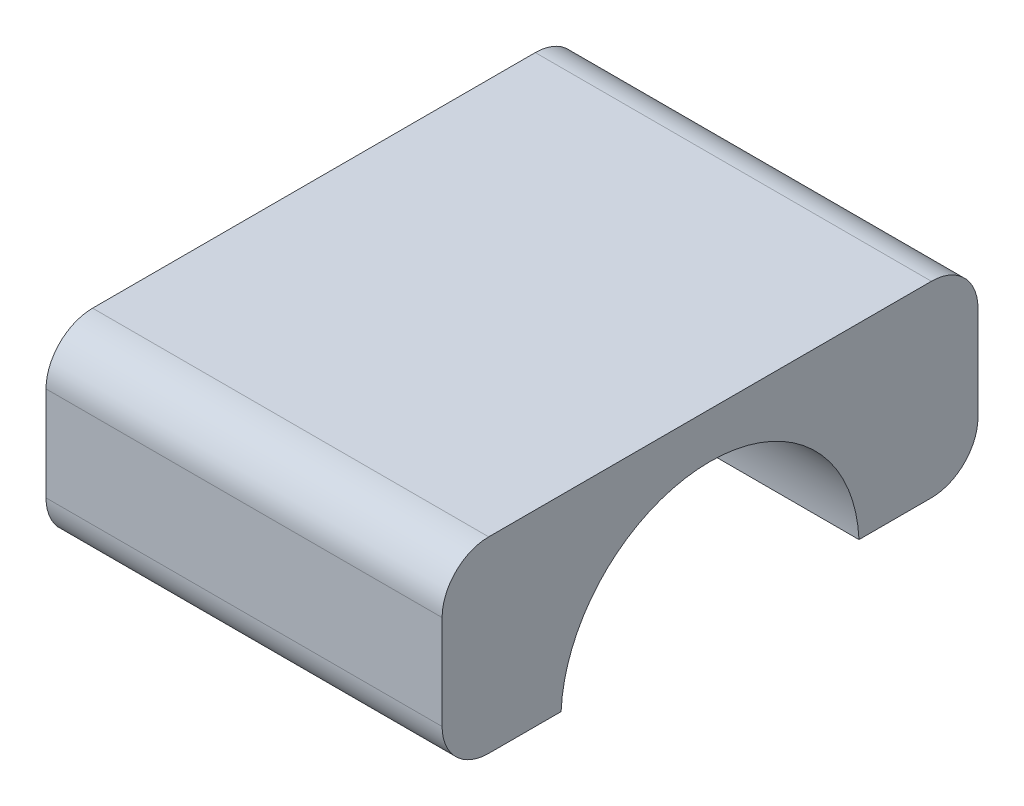
ISO-10303-21;
HEADER;
FILE_DESCRIPTION(('STEP AP214'),'2;1');
FILE_NAME('part.step','',(''),(''),'','','');
FILE_SCHEMA(('AUTOMOTIVE_DESIGN { 1 0 10303 214 1 1 1 1 }'));
ENDSEC;
DATA;
#1=APPLICATION_CONTEXT('core data for automotive mechanical design processes');
#2=APPLICATION_PROTOCOL_DEFINITION('international standard','automotive_design',2000,#1);
#3=PRODUCT_CONTEXT('',#1,'mechanical');
#4=PRODUCT('Part','Part','',(#3));
#5=PRODUCT_RELATED_PRODUCT_CATEGORY('part','',(#4));
#6=PRODUCT_DEFINITION_FORMATION('','',#4);
#7=PRODUCT_DEFINITION_CONTEXT('part definition',#1,'design');
#8=PRODUCT_DEFINITION('design','',#6,#7);
#9=PRODUCT_DEFINITION_SHAPE('','',#8);
#10=(LENGTH_UNIT() NAMED_UNIT(*) SI_UNIT(.MILLI.,.METRE.));
#11=(NAMED_UNIT(*) PLANE_ANGLE_UNIT() SI_UNIT($,.RADIAN.));
#12=(NAMED_UNIT(*) SI_UNIT($,.STERADIAN.) SOLID_ANGLE_UNIT());
#13=UNCERTAINTY_MEASURE_WITH_UNIT(LENGTH_MEASURE(1.E-05),#10,'distance_accuracy_value','');
#14=(GEOMETRIC_REPRESENTATION_CONTEXT(3) GLOBAL_UNCERTAINTY_ASSIGNED_CONTEXT((#13)) GLOBAL_UNIT_ASSIGNED_CONTEXT((#10,
#11,#12)) REPRESENTATION_CONTEXT('',''));
#15=CARTESIAN_POINT('',(0.,0.,0.));
#16=DIRECTION('',(0.,0.,1.));
#17=DIRECTION('',(1.,0.,0.));
#18=AXIS2_PLACEMENT_3D('',#15,#16,#17);
#19=CARTESIAN_POINT('',(17.,4.6,19.));
#20=DIRECTION('',(-1.,0.,0.));
#21=DIRECTION('',(0.,0.,1.));
#22=AXIS2_PLACEMENT_3D('',#19,#20,#21);
#23=CYLINDRICAL_SURFACE('',#22,4.);
#24=CARTESIAN_POINT('',(-10.6771243444677,0.6,19.));
#25=CARTESIAN_POINT('',(-10.7192506551599,0.600001174078135,19.0371518846942));
#26=CARTESIAN_POINT('',(-10.762919419632,0.600517310211942,19.0725074408913));
#27=CARTESIAN_POINT('',(-10.8530570336111,0.602290069309495,19.1394128146137));
#28=CARTESIAN_POINT('',(-10.8995254438069,0.603546576366918,19.1709632269095));
#29=CARTESIAN_POINT('',(-11.0425949485409,0.607988949122822,19.2595242307361));
#30=CARTESIAN_POINT('',(-11.1429753550835,0.611849230477293,19.3105458176302));
#31=CARTESIAN_POINT('',(-11.3508425605567,0.619327815303025,19.3950466501506));
#32=CARTESIAN_POINT('',(-11.4583309959682,0.622946062662407,19.4285218401249));
#33=CARTESIAN_POINT('',(-11.6774117692618,0.628466654639228,19.476994699731));
#34=CARTESIAN_POINT('',(-11.7890022984932,0.630369746260196,19.4920004144345));
#35=CARTESIAN_POINT('',(-12.0130484507786,0.631760391016297,19.5030985950613));
#36=CARTESIAN_POINT('',(-12.1255033675481,0.631249742329856,19.4992051403526));
#37=CARTESIAN_POINT('',(-12.3482139907828,0.628000437430484,19.4726447894183));
#38=CARTESIAN_POINT('',(-12.4584682827526,0.62526039266211,19.4499661929096));
#39=CARTESIAN_POINT('',(-12.673302325334,0.618598040792685,19.386581122766));
#40=CARTESIAN_POINT('',(-12.7778954111779,0.614678668676915,19.3459192872305));
#41=CARTESIAN_POINT('',(-12.9787287494616,0.607377499454782,19.2477239447546));
#42=CARTESIAN_POINT('',(-13.0749834093817,0.603994766357509,19.190220322867));
#43=CARTESIAN_POINT('',(-13.1929282707095,0.601347443085335,19.1056317655857));
#44=CARTESIAN_POINT('',(-13.2196776259688,0.60085739692341,19.0854065409097));
#45=CARTESIAN_POINT('',(-13.2720902769434,0.600183897303602,19.0436656427182));
#46=CARTESIAN_POINT('',(-13.2977550931037,0.599999999741905,19.0221518854178));
#47=CARTESIAN_POINT('',(-13.3228756555323,0.6,19.));
#48=B_SPLINE_CURVE_WITH_KNOTS('',3,(#24,#25,#26,#27,#28,#29,#30,#31,#32,#33,#34,#35,#36,#37,#38,
#39,#40,#41,#42,#43,#44,#45,#46,#47),.UNSPECIFIED.,.F.,.F.,(4,2,2,2,2,2,2,2,2,2,2,4),(0.,
0.16839344658215,0.336760537886406,0.673040899125638,1.0093989535434,1.34561044270103,
1.68157150188485,2.01774197113865,2.35308263893527,2.68783182694749,2.78841696352058,
2.88885606221805),.UNSPECIFIED.);
#49=CARTESIAN_POINT('',(-10.6771243444677,0.6,19.));
#50=VERTEX_POINT('',#49);
#51=CARTESIAN_POINT('',(-13.3228756555323,0.6,19.));
#52=VERTEX_POINT('',#51);
#53=EDGE_CURVE('E11',#50,#52,#48,.T.);
#54=ORIENTED_EDGE('',*,*,#53,.F.);
#55=DIRECTION('',(-1.,0.,0.));
#56=VECTOR('',#55,1.);
#57=CARTESIAN_POINT('',(17.,0.6,19.));
#58=LINE('',#57,#56);
#59=CARTESIAN_POINT('',(10.6771243444677,0.6,19.));
#60=VERTEX_POINT('',#59);
#61=EDGE_CURVE('E174',#60,#50,#58,.T.);
#62=ORIENTED_EDGE('',*,*,#61,.F.);
#63=CARTESIAN_POINT('',(13.3228756555323,0.6,19.));
#64=CARTESIAN_POINT('',(13.2807493448401,0.600001174078135,19.0371518846942));
#65=CARTESIAN_POINT('',(13.237080580368,0.600517310211942,19.0725074408913));
#66=CARTESIAN_POINT('',(13.1469429663889,0.602290069309495,19.1394128146137));
#67=CARTESIAN_POINT('',(13.1004745561931,0.603546576366918,19.1709632269095));
#68=CARTESIAN_POINT('',(12.9574050514591,0.607988949122822,19.2595242307361));
#69=CARTESIAN_POINT('',(12.8570246449165,0.611849230477293,19.3105458176302));
#70=CARTESIAN_POINT('',(12.6491574394433,0.619327815303025,19.3950466501506));
#71=CARTESIAN_POINT('',(12.5416690040318,0.622946062662407,19.4285218401249));
#72=CARTESIAN_POINT('',(12.3225882307382,0.628466654639228,19.476994699731));
#73=CARTESIAN_POINT('',(12.2109977015068,0.630369746260196,19.4920004144345));
#74=CARTESIAN_POINT('',(11.9869515492214,0.631760391016297,19.5030985950613));
#75=CARTESIAN_POINT('',(11.8744966324519,0.631249742329856,19.4992051403526));
#76=CARTESIAN_POINT('',(11.6517860092172,0.628000437430484,19.4726447894183));
#77=CARTESIAN_POINT('',(11.5415317172474,0.62526039266211,19.4499661929096));
#78=CARTESIAN_POINT('',(11.326697674666,0.618598040792685,19.386581122766));
#79=CARTESIAN_POINT('',(11.2221045888221,0.614678668676915,19.3459192872305));
#80=CARTESIAN_POINT('',(11.0212712505384,0.607377499454782,19.2477239447546));
#81=CARTESIAN_POINT('',(10.9250165906183,0.603994766357509,19.190220322867));
#82=CARTESIAN_POINT('',(10.8070717292905,0.601347443085335,19.1056317655857));
#83=CARTESIAN_POINT('',(10.7803223740312,0.60085739692341,19.0854065409097));
#84=CARTESIAN_POINT('',(10.7279097230566,0.600183897303602,19.0436656427182));
#85=CARTESIAN_POINT('',(10.7022449068963,0.599999999741905,19.0221518854178));
#86=CARTESIAN_POINT('',(10.6771243444677,0.6,19.));
#87=B_SPLINE_CURVE_WITH_KNOTS('',3,(#63,#64,#65,#66,#67,#68,#69,#70,#71,#72,#73,#74,#75,#76,#77,
#78,#79,#80,#81,#82,#83,#84,#85,#86),.UNSPECIFIED.,.F.,.F.,(4,2,2,2,2,2,2,2,2,2,2,4),(0.,
0.16839344658215,0.336760537886406,0.673040899125638,1.0093989535434,1.34561044270103,
1.68157150188485,2.01774197113865,2.35308263893527,2.68783182694749,2.78841696352057,
2.88885606221805),.UNSPECIFIED.);
#88=CARTESIAN_POINT('',(13.3228756555323,0.6,19.));
#89=VERTEX_POINT('',#88);
#90=EDGE_CURVE('E52',#89,#60,#87,.T.);
#91=ORIENTED_EDGE('',*,*,#90,.F.);
#92=CARTESIAN_POINT('',(17.,0.6,19.));
#93=VERTEX_POINT('',#92);
#94=EDGE_CURVE('E151',#93,#89,#58,.T.);
#95=ORIENTED_EDGE('',*,*,#94,.F.);
#96=CARTESIAN_POINT('',(17.,4.6,19.));
#97=DIRECTION('',(1.,0.,0.));
#98=DIRECTION('',(0.,0.,-1.));
#99=AXIS2_PLACEMENT_3D('',#96,#97,#98);
#100=CIRCLE('',#99,4.);
#101=CARTESIAN_POINT('',(17.,4.6,23.));
#102=VERTEX_POINT('',#101);
#103=EDGE_CURVE('E278',#102,#93,#100,.T.);
#104=ORIENTED_EDGE('',*,*,#103,.F.);
#105=DIRECTION('',(-1.,0.,0.));
#106=VECTOR('',#105,1.);
#107=CARTESIAN_POINT('',(17.,4.6,23.));
#108=LINE('',#107,#106);
#109=CARTESIAN_POINT('',(-17.,4.6,23.));
#110=VERTEX_POINT('',#109);
#111=EDGE_CURVE('E257',#102,#110,#108,.T.);
#112=ORIENTED_EDGE('',*,*,#111,.T.);
#113=CARTESIAN_POINT('',(-17.,4.6,19.));
#114=DIRECTION('',(1.,0.,0.));
#115=DIRECTION('',(0.,0.,-1.));
#116=AXIS2_PLACEMENT_3D('',#113,#114,#115);
#117=CIRCLE('',#116,4.);
#118=CARTESIAN_POINT('',(-17.,0.6,19.));
#119=VERTEX_POINT('',#118);
#120=EDGE_CURVE('E258',#110,#119,#117,.T.);
#121=ORIENTED_EDGE('',*,*,#120,.T.);
#122=EDGE_CURVE('E168',#52,#119,#58,.T.);
#123=ORIENTED_EDGE('',*,*,#122,.F.);
#124=EDGE_LOOP('',(#54,#62,#91,#95,#104,#112,#121,#123));
#125=FACE_BOUND('',#124,.T.);
#126=ADVANCED_FACE('F39',(#125),#23,.T.);
#127=CARTESIAN_POINT('',(17.,4.6,-19.));
#128=DIRECTION('',(-1.,0.,0.));
#129=DIRECTION('',(0.,0.,1.));
#130=AXIS2_PLACEMENT_3D('',#127,#128,#129);
#131=CYLINDRICAL_SURFACE('',#130,4.);
#132=CARTESIAN_POINT('',(10.6771243444677,0.6,-19.));
#133=CARTESIAN_POINT('',(10.7192506551599,0.600001174078135,-19.0371518846942));
#134=CARTESIAN_POINT('',(10.762919419632,0.600517310211942,-19.0725074408913));
#135=CARTESIAN_POINT('',(10.8530570336111,0.602290069309495,-19.1394128146137));
#136=CARTESIAN_POINT('',(10.8995254438069,0.603546576366918,-19.1709632269095));
#137=CARTESIAN_POINT('',(11.0425949485409,0.607988949122822,-19.2595242307361));
#138=CARTESIAN_POINT('',(11.1429753550835,0.611849230477293,-19.3105458176302));
#139=CARTESIAN_POINT('',(11.3508425605567,0.619327815303025,-19.3950466501506));
#140=CARTESIAN_POINT('',(11.4583309959682,0.622946062662407,-19.4285218401249));
#141=CARTESIAN_POINT('',(11.6774117692618,0.628466654639228,-19.476994699731));
#142=CARTESIAN_POINT('',(11.7890022984932,0.630369746260196,-19.4920004144345));
#143=CARTESIAN_POINT('',(12.0130484507786,0.631760391016297,-19.5030985950613));
#144=CARTESIAN_POINT('',(12.1255033675481,0.631249742329856,-19.4992051403526));
#145=CARTESIAN_POINT('',(12.3482139907828,0.628000437430484,-19.4726447894183));
#146=CARTESIAN_POINT('',(12.4584682827526,0.62526039266211,-19.4499661929096));
#147=CARTESIAN_POINT('',(12.673302325334,0.618598040792685,-19.386581122766));
#148=CARTESIAN_POINT('',(12.7778954111779,0.614678668676915,-19.3459192872305));
#149=CARTESIAN_POINT('',(12.9787287494616,0.607377499454782,-19.2477239447546));
#150=CARTESIAN_POINT('',(13.0749834093817,0.603994766357509,-19.190220322867));
#151=CARTESIAN_POINT('',(13.1929282707095,0.601347443085335,-19.1056317655857));
#152=CARTESIAN_POINT('',(13.2196776259688,0.60085739692341,-19.0854065409097));
#153=CARTESIAN_POINT('',(13.2720902769434,0.600183897303602,-19.0436656427182));
#154=CARTESIAN_POINT('',(13.2977550931037,0.599999999741905,-19.0221518854178));
#155=CARTESIAN_POINT('',(13.3228756555323,0.6,-19.));
#156=B_SPLINE_CURVE_WITH_KNOTS('',3,(#132,#133,#134,#135,#136,#137,#138,#139,#140,#141,#142,
#143,#144,#145,#146,#147,#148,#149,#150,#151,#152,#153,#154,#155),.UNSPECIFIED.,.F.,.F.,(4,2,2,
2,2,2,2,2,2,2,2,4),(0.,0.16839344658215,0.336760537886406,0.673040899125638,1.0093989535434,
1.34561044270103,1.68157150188485,2.01774197113865,2.35308263893527,2.68783182694749,
2.78841696352058,2.88885606221805),.UNSPECIFIED.);
#157=CARTESIAN_POINT('',(10.6771243444677,0.6,-19.));
#158=VERTEX_POINT('',#157);
#159=CARTESIAN_POINT('',(13.3228756555323,0.6,-19.));
#160=VERTEX_POINT('',#159);
#161=EDGE_CURVE('E150',#158,#160,#156,.T.);
#162=ORIENTED_EDGE('',*,*,#161,.F.);
#163=DIRECTION('',(-1.,0.,0.));
#164=VECTOR('',#163,1.);
#165=CARTESIAN_POINT('',(17.,0.6,-19.));
#166=LINE('',#165,#164);
#167=CARTESIAN_POINT('',(-10.6771243444677,0.6,-19.));
#168=VERTEX_POINT('',#167);
#169=EDGE_CURVE('E157',#158,#168,#166,.T.);
#170=ORIENTED_EDGE('',*,*,#169,.T.);
#171=CARTESIAN_POINT('',(-13.3228756555323,0.6,-19.));
#172=CARTESIAN_POINT('',(-13.2807493448401,0.600001174078135,-19.0371518846942));
#173=CARTESIAN_POINT('',(-13.237080580368,0.600517310211942,-19.0725074408913));
#174=CARTESIAN_POINT('',(-13.1469429663889,0.602290069309495,-19.1394128146137));
#175=CARTESIAN_POINT('',(-13.1004745561931,0.603546576366918,-19.1709632269095));
#176=CARTESIAN_POINT('',(-12.9574050514591,0.607988949122822,-19.2595242307361));
#177=CARTESIAN_POINT('',(-12.8570246449165,0.611849230477293,-19.3105458176302));
#178=CARTESIAN_POINT('',(-12.6491574394433,0.619327815303025,-19.3950466501506));
#179=CARTESIAN_POINT('',(-12.5416690040318,0.622946062662407,-19.4285218401249));
#180=CARTESIAN_POINT('',(-12.3225882307382,0.628466654639228,-19.476994699731));
#181=CARTESIAN_POINT('',(-12.2109977015068,0.630369746260196,-19.4920004144345));
#182=CARTESIAN_POINT('',(-11.9869515492214,0.631760391016297,-19.5030985950613));
#183=CARTESIAN_POINT('',(-11.8744966324519,0.631249742329856,-19.4992051403526));
#184=CARTESIAN_POINT('',(-11.6517860092172,0.628000437430484,-19.4726447894183));
#185=CARTESIAN_POINT('',(-11.5415317172474,0.62526039266211,-19.4499661929096));
#186=CARTESIAN_POINT('',(-11.326697674666,0.618598040792685,-19.386581122766));
#187=CARTESIAN_POINT('',(-11.2221045888221,0.614678668676915,-19.3459192872305));
#188=CARTESIAN_POINT('',(-11.0212712505384,0.607377499454782,-19.2477239447546));
#189=CARTESIAN_POINT('',(-10.9250165906183,0.603994766357509,-19.190220322867));
#190=CARTESIAN_POINT('',(-10.8070717292905,0.601347443085335,-19.1056317655857));
#191=CARTESIAN_POINT('',(-10.7803223740312,0.60085739692341,-19.0854065409097));
#192=CARTESIAN_POINT('',(-10.7279097230566,0.600183897303602,-19.0436656427182));
#193=CARTESIAN_POINT('',(-10.7022449068963,0.599999999741905,-19.0221518854178));
#194=CARTESIAN_POINT('',(-10.6771243444677,0.6,-19.));
#195=B_SPLINE_CURVE_WITH_KNOTS('',3,(#171,#172,#173,#174,#175,#176,#177,#178,#179,#180,#181,
#182,#183,#184,#185,#186,#187,#188,#189,#190,#191,#192,#193,#194),.UNSPECIFIED.,.F.,.F.,(4,2,2,
2,2,2,2,2,2,2,2,4),(0.,0.16839344658215,0.336760537886406,0.673040899125638,1.0093989535434,
1.34561044270103,1.68157150188485,2.01774197113865,2.35308263893527,2.68783182694749,
2.78841696352057,2.88885606221805),.UNSPECIFIED.);
#196=CARTESIAN_POINT('',(-13.3228756555323,0.6,-19.));
#197=VERTEX_POINT('',#196);
#198=EDGE_CURVE('E143',#197,#168,#195,.T.);
#199=ORIENTED_EDGE('',*,*,#198,.F.);
#200=CARTESIAN_POINT('',(-17.,0.6,-19.));
#201=VERTEX_POINT('',#200);
#202=EDGE_CURVE('E159',#197,#201,#166,.T.);
#203=ORIENTED_EDGE('',*,*,#202,.T.);
#204=CARTESIAN_POINT('',(-17.,4.6,-19.));
#205=DIRECTION('',(1.,0.,0.));
#206=DIRECTION('',(0.,0.,-1.));
#207=AXIS2_PLACEMENT_3D('',#204,#205,#206);
#208=CIRCLE('',#207,4.);
#209=CARTESIAN_POINT('',(-17.,4.6,-23.));
#210=VERTEX_POINT('',#209);
#211=EDGE_CURVE('E266',#201,#210,#208,.T.);
#212=ORIENTED_EDGE('',*,*,#211,.T.);
#213=DIRECTION('',(-1.,0.,0.));
#214=VECTOR('',#213,1.);
#215=CARTESIAN_POINT('',(17.,4.6,-23.));
#216=LINE('',#215,#214);
#217=CARTESIAN_POINT('',(17.,4.6,-23.));
#218=VERTEX_POINT('',#217);
#219=EDGE_CURVE('E169',#218,#210,#216,.T.);
#220=ORIENTED_EDGE('',*,*,#219,.F.);
#221=CARTESIAN_POINT('',(17.,4.6,-19.));
#222=DIRECTION('',(1.,0.,0.));
#223=DIRECTION('',(0.,0.,-1.));
#224=AXIS2_PLACEMENT_3D('',#221,#222,#223);
#225=CIRCLE('',#224,4.);
#226=CARTESIAN_POINT('',(17.,0.6,-19.));
#227=VERTEX_POINT('',#226);
#228=EDGE_CURVE('E236',#227,#218,#225,.T.);
#229=ORIENTED_EDGE('',*,*,#228,.F.);
#230=EDGE_CURVE('E166',#227,#160,#166,.T.);
#231=ORIENTED_EDGE('',*,*,#230,.T.);
#232=EDGE_LOOP('',(#162,#170,#199,#203,#212,#220,#229,#231));
#233=FACE_BOUND('',#232,.T.);
#234=ADVANCED_FACE('F164',(#233),#131,.T.);
#235=CARTESIAN_POINT('',(17.,0.6,19.));
#236=DIRECTION('',(0.,1.,0.));
#237=DIRECTION('',(0.,0.,1.));
#238=AXIS2_PLACEMENT_3D('',#235,#236,#237);
#239=PLANE('',#238);
#240=CARTESIAN_POINT('',(-12.,0.6,17.5));
#241=DIRECTION('',(0.,1.,0.));
#242=DIRECTION('',(0.,0.,1.));
#243=AXIS2_PLACEMENT_3D('',#240,#241,#242);
#244=CIRCLE('',#243,2.);
#245=EDGE_CURVE('E57',#50,#52,#244,.T.);
#246=ORIENTED_EDGE('',*,*,#245,.T.);
#247=ORIENTED_EDGE('',*,*,#122,.T.);
#248=DIRECTION('',(0.,0.,-1.));
#249=VECTOR('',#248,1.);
#250=CARTESIAN_POINT('',(-17.,0.6,19.));
#251=LINE('',#250,#249);
#252=CARTESIAN_POINT('',(-17.,0.6,12.7859297667397));
#253=VERTEX_POINT('',#252);
#254=EDGE_CURVE('E263',#119,#253,#251,.T.);
#255=ORIENTED_EDGE('',*,*,#254,.T.);
#256=DIRECTION('',(1.,0.,0.));
#257=VECTOR('',#256,1.);
#258=CARTESIAN_POINT('',(-17.,0.6,12.7859297667397));
#259=LINE('',#258,#257);
#260=CARTESIAN_POINT('',(17.,0.6,12.7859297667397));
#261=VERTEX_POINT('',#260);
#262=EDGE_CURVE('E262',#253,#261,#259,.T.);
#263=ORIENTED_EDGE('',*,*,#262,.T.);
#264=DIRECTION('',(0.,0.,-1.));
#265=VECTOR('',#264,1.);
#266=CARTESIAN_POINT('',(17.,0.6,19.));
#267=LINE('',#266,#265);
#268=EDGE_CURVE('E241',#93,#261,#267,.T.);
#269=ORIENTED_EDGE('',*,*,#268,.F.);
#270=ORIENTED_EDGE('',*,*,#94,.T.);
#271=CARTESIAN_POINT('',(12.,0.6,17.5));
#272=DIRECTION('',(0.,1.,0.));
#273=DIRECTION('',(0.,0.,1.));
#274=AXIS2_PLACEMENT_3D('',#271,#272,#273);
#275=CIRCLE('',#274,2.);
#276=EDGE_CURVE('E64',#89,#60,#275,.T.);
#277=ORIENTED_EDGE('',*,*,#276,.T.);
#278=ORIENTED_EDGE('',*,*,#61,.T.);
#279=EDGE_LOOP('',(#246,#247,#255,#263,#269,#270,#277,#278));
#280=FACE_BOUND('',#279,.T.);
#281=ADVANCED_FACE('F352',(#280),#239,.F.);
#282=CARTESIAN_POINT('',(12.,0.6,-17.5));
#283=DIRECTION('',(0.,1.,0.));
#284=DIRECTION('',(0.,0.,1.));
#285=AXIS2_PLACEMENT_3D('',#282,#283,#284);
#286=CIRCLE('',#285,2.);
#287=EDGE_CURVE('E229',#158,#160,#286,.T.);
#288=ORIENTED_EDGE('',*,*,#287,.T.);
#289=ORIENTED_EDGE('',*,*,#230,.F.);
#290=CARTESIAN_POINT('',(17.,0.6,-12.7859297667397));
#291=VERTEX_POINT('',#290);
#292=EDGE_CURVE('E246',#291,#227,#267,.T.);
#293=ORIENTED_EDGE('',*,*,#292,.F.);
#294=DIRECTION('',(1.,0.,0.));
#295=VECTOR('',#294,1.);
#296=CARTESIAN_POINT('',(-17.,0.6,-12.7859297667397));
#297=LINE('',#296,#295);
#298=CARTESIAN_POINT('',(-17.,0.6,-12.7859297667397));
#299=VERTEX_POINT('',#298);
#300=EDGE_CURVE('E329',#291,#299,#297,.F.);
#301=ORIENTED_EDGE('',*,*,#300,.T.);
#302=EDGE_CURVE('E261',#299,#201,#251,.T.);
#303=ORIENTED_EDGE('',*,*,#302,.T.);
#304=ORIENTED_EDGE('',*,*,#202,.F.);
#305=CARTESIAN_POINT('',(-12.,0.6,-17.5));
#306=DIRECTION('',(0.,1.,0.));
#307=DIRECTION('',(0.,0.,1.));
#308=AXIS2_PLACEMENT_3D('',#305,#306,#307);
#309=CIRCLE('',#308,2.);
#310=EDGE_CURVE('E146',#197,#168,#309,.T.);
#311=ORIENTED_EDGE('',*,*,#310,.T.);
#312=ORIENTED_EDGE('',*,*,#169,.F.);
#313=EDGE_LOOP('',(#288,#289,#293,#301,#303,#304,#311,#312));
#314=FACE_BOUND('',#313,.T.);
#315=ADVANCED_FACE('F156',(#314),#239,.F.);
#316=CARTESIAN_POINT('',(17.,4.6,-23.));
#317=DIRECTION('',(0.,0.,1.));
#318=DIRECTION('',(1.,0.,0.));
#319=AXIS2_PLACEMENT_3D('',#316,#317,#318);
#320=PLANE('',#319);
#321=DIRECTION('',(0.,1.,0.));
#322=VECTOR('',#321,1.);
#323=CARTESIAN_POINT('',(-17.,4.6,-23.));
#324=LINE('',#323,#322);
#325=CARTESIAN_POINT('',(-17.,12.7,-23.));
#326=VERTEX_POINT('',#325);
#327=EDGE_CURVE('E268',#210,#326,#324,.T.);
#328=ORIENTED_EDGE('',*,*,#327,.T.);
#329=DIRECTION('',(-1.,0.,0.));
#330=VECTOR('',#329,1.);
#331=CARTESIAN_POINT('',(17.,12.7,-23.));
#332=LINE('',#331,#330);
#333=CARTESIAN_POINT('',(17.,12.7,-23.));
#334=VERTEX_POINT('',#333);
#335=EDGE_CURVE('E289',#334,#326,#332,.T.);
#336=ORIENTED_EDGE('',*,*,#335,.F.);
#337=DIRECTION('',(0.,1.,0.));
#338=VECTOR('',#337,1.);
#339=CARTESIAN_POINT('',(17.,4.6,-23.));
#340=LINE('',#339,#338);
#341=EDGE_CURVE('E240',#218,#334,#340,.T.);
#342=ORIENTED_EDGE('',*,*,#341,.F.);
#343=ORIENTED_EDGE('',*,*,#219,.T.);
#344=EDGE_LOOP('',(#328,#336,#342,#343));
#345=FACE_BOUND('',#344,.T.);
#346=ADVANCED_FACE('F297',(#345),#320,.F.);
#347=CARTESIAN_POINT('',(17.,12.7,-19.));
#348=DIRECTION('',(-1.,0.,0.));
#349=DIRECTION('',(0.,0.,1.));
#350=AXIS2_PLACEMENT_3D('',#347,#348,#349);
#351=CYLINDRICAL_SURFACE('',#350,4.);
#352=CARTESIAN_POINT('',(-17.,12.7,-19.));
#353=DIRECTION('',(1.,0.,0.));
#354=DIRECTION('',(0.,0.,-1.));
#355=AXIS2_PLACEMENT_3D('',#352,#353,#354);
#356=CIRCLE('',#355,4.);
#357=CARTESIAN_POINT('',(-17.,16.7,-19.));
#358=VERTEX_POINT('',#357);
#359=EDGE_CURVE('E270',#326,#358,#356,.T.);
#360=ORIENTED_EDGE('',*,*,#359,.T.);
#361=DIRECTION('',(-1.,0.,0.));
#362=VECTOR('',#361,1.);
#363=CARTESIAN_POINT('',(17.,16.7,-19.));
#364=LINE('',#363,#362);
#365=CARTESIAN_POINT('',(17.,16.7,-19.));
#366=VERTEX_POINT('',#365);
#367=EDGE_CURVE('E287',#366,#358,#364,.T.);
#368=ORIENTED_EDGE('',*,*,#367,.F.);
#369=CARTESIAN_POINT('',(17.,12.7,-19.));
#370=DIRECTION('',(1.,0.,0.));
#371=DIRECTION('',(0.,0.,-1.));
#372=AXIS2_PLACEMENT_3D('',#369,#370,#371);
#373=CIRCLE('',#372,4.);
#374=EDGE_CURVE('E243',#334,#366,#373,.T.);
#375=ORIENTED_EDGE('',*,*,#374,.F.);
#376=ORIENTED_EDGE('',*,*,#335,.T.);
#377=EDGE_LOOP('',(#360,#368,#375,#376));
#378=FACE_BOUND('',#377,.T.);
#379=ADVANCED_FACE('F305',(#378),#351,.T.);
#380=CARTESIAN_POINT('',(17.,16.7,-19.));
#381=DIRECTION('',(0.,-1.,0.));
#382=DIRECTION('',(0.,0.,-1.));
#383=AXIS2_PLACEMENT_3D('',#380,#381,#382);
#384=PLANE('',#383);
#385=DIRECTION('',(0.,0.,1.));
#386=VECTOR('',#385,1.);
#387=CARTESIAN_POINT('',(-17.,16.7,-19.));
#388=LINE('',#387,#386);
#389=CARTESIAN_POINT('',(-17.,16.7,19.));
#390=VERTEX_POINT('',#389);
#391=EDGE_CURVE('E272',#358,#390,#388,.T.);
#392=ORIENTED_EDGE('',*,*,#391,.T.);
#393=DIRECTION('',(-1.,0.,0.));
#394=VECTOR('',#393,1.);
#395=CARTESIAN_POINT('',(17.,16.7,19.));
#396=LINE('',#395,#394);
#397=CARTESIAN_POINT('',(17.,16.7,19.));
#398=VERTEX_POINT('',#397);
#399=EDGE_CURVE('E284',#398,#390,#396,.T.);
#400=ORIENTED_EDGE('',*,*,#399,.F.);
#401=DIRECTION('',(0.,0.,1.));
#402=VECTOR('',#401,1.);
#403=CARTESIAN_POINT('',(17.,16.7,-19.));
#404=LINE('',#403,#402);
#405=EDGE_CURVE('E251',#366,#398,#404,.T.);
#406=ORIENTED_EDGE('',*,*,#405,.F.);
#407=ORIENTED_EDGE('',*,*,#367,.T.);
#408=EDGE_LOOP('',(#392,#400,#406,#407));
#409=FACE_BOUND('',#408,.T.);
#410=ADVANCED_FACE('F308',(#409),#384,.F.);
#411=CARTESIAN_POINT('',(17.,12.7,19.));
#412=DIRECTION('',(-1.,0.,0.));
#413=DIRECTION('',(0.,0.,1.));
#414=AXIS2_PLACEMENT_3D('',#411,#412,#413);
#415=CYLINDRICAL_SURFACE('',#414,4.);
#416=CARTESIAN_POINT('',(-17.,12.7,19.));
#417=DIRECTION('',(1.,0.,0.));
#418=DIRECTION('',(0.,0.,-1.));
#419=AXIS2_PLACEMENT_3D('',#416,#417,#418);
#420=CIRCLE('',#419,4.);
#421=CARTESIAN_POINT('',(-17.,12.7,23.));
#422=VERTEX_POINT('',#421);
#423=EDGE_CURVE('E274',#390,#422,#420,.T.);
#424=ORIENTED_EDGE('',*,*,#423,.T.);
#425=DIRECTION('',(-1.,0.,0.));
#426=VECTOR('',#425,1.);
#427=CARTESIAN_POINT('',(17.,12.7,23.));
#428=LINE('',#427,#426);
#429=CARTESIAN_POINT('',(17.,12.7,23.));
#430=VERTEX_POINT('',#429);
#431=EDGE_CURVE('E281',#430,#422,#428,.T.);
#432=ORIENTED_EDGE('',*,*,#431,.F.);
#433=CARTESIAN_POINT('',(17.,12.7,19.));
#434=DIRECTION('',(1.,0.,0.));
#435=DIRECTION('',(0.,0.,-1.));
#436=AXIS2_PLACEMENT_3D('',#433,#434,#435);
#437=CIRCLE('',#436,4.);
#438=EDGE_CURVE('E253',#398,#430,#437,.T.);
#439=ORIENTED_EDGE('',*,*,#438,.F.);
#440=ORIENTED_EDGE('',*,*,#399,.T.);
#441=EDGE_LOOP('',(#424,#432,#439,#440));
#442=FACE_BOUND('',#441,.T.);
#443=ADVANCED_FACE('F318',(#442),#415,.T.);
#444=CARTESIAN_POINT('',(17.,12.7,23.));
#445=DIRECTION('',(0.,0.,-1.));
#446=DIRECTION('',(-1.,0.,0.));
#447=AXIS2_PLACEMENT_3D('',#444,#445,#446);
#448=PLANE('',#447);
#449=DIRECTION('',(0.,-1.,0.));
#450=VECTOR('',#449,1.);
#451=CARTESIAN_POINT('',(-17.,12.7,23.));
#452=LINE('',#451,#450);
#453=EDGE_CURVE('E276',#422,#110,#452,.T.);
#454=ORIENTED_EDGE('',*,*,#453,.T.);
#455=ORIENTED_EDGE('',*,*,#111,.F.);
#456=DIRECTION('',(0.,-1.,0.));
#457=VECTOR('',#456,1.);
#458=CARTESIAN_POINT('',(17.,12.7,23.));
#459=LINE('',#458,#457);
#460=EDGE_CURVE('E255',#430,#102,#459,.T.);
#461=ORIENTED_EDGE('',*,*,#460,.F.);
#462=ORIENTED_EDGE('',*,*,#431,.T.);
#463=EDGE_LOOP('',(#454,#455,#461,#462));
#464=FACE_BOUND('',#463,.T.);
#465=ADVANCED_FACE('F321',(#464),#448,.F.);
#466=CARTESIAN_POINT('',(17.,4.6,19.));
#467=DIRECTION('',(1.,0.,0.));
#468=DIRECTION('',(0.,0.,-1.));
#469=AXIS2_PLACEMENT_3D('',#466,#467,#468);
#470=PLANE('',#469);
#471=CARTESIAN_POINT('',(17.,0.,0.));
#472=DIRECTION('',(1.,0.,0.));
#473=DIRECTION('',(0.,0.,-1.));
#474=AXIS2_PLACEMENT_3D('',#471,#472,#473);
#475=CIRCLE('',#474,12.8);
#476=EDGE_CURVE('E335',#291,#261,#475,.T.);
#477=ORIENTED_EDGE('',*,*,#476,.F.);
#478=ORIENTED_EDGE('',*,*,#292,.T.);
#479=ORIENTED_EDGE('',*,*,#228,.T.);
#480=ORIENTED_EDGE('',*,*,#341,.T.);
#481=ORIENTED_EDGE('',*,*,#374,.T.);
#482=ORIENTED_EDGE('',*,*,#405,.T.);
#483=ORIENTED_EDGE('',*,*,#438,.T.);
#484=ORIENTED_EDGE('',*,*,#460,.T.);
#485=ORIENTED_EDGE('',*,*,#103,.T.);
#486=ORIENTED_EDGE('',*,*,#268,.T.);
#487=EDGE_LOOP('',(#477,#478,#479,#480,#481,#482,#483,#484,#485,#486));
#488=FACE_BOUND('',#487,.T.);
#489=ADVANCED_FACE('F312',(#488),#470,.T.);
#490=CARTESIAN_POINT('',(-17.,4.6,19.));
#491=DIRECTION('',(1.,0.,0.));
#492=DIRECTION('',(0.,0.,-1.));
#493=AXIS2_PLACEMENT_3D('',#490,#491,#492);
#494=PLANE('',#493);
#495=ORIENTED_EDGE('',*,*,#302,.F.);
#496=CARTESIAN_POINT('',(-17.,0.,0.));
#497=DIRECTION('',(1.,0.,0.));
#498=DIRECTION('',(0.,0.,-1.));
#499=AXIS2_PLACEMENT_3D('',#496,#497,#498);
#500=CIRCLE('',#499,12.8);
#501=EDGE_CURVE('E332',#299,#253,#500,.T.);
#502=ORIENTED_EDGE('',*,*,#501,.T.);
#503=ORIENTED_EDGE('',*,*,#254,.F.);
#504=ORIENTED_EDGE('',*,*,#120,.F.);
#505=ORIENTED_EDGE('',*,*,#453,.F.);
#506=ORIENTED_EDGE('',*,*,#423,.F.);
#507=ORIENTED_EDGE('',*,*,#391,.F.);
#508=ORIENTED_EDGE('',*,*,#359,.F.);
#509=ORIENTED_EDGE('',*,*,#327,.F.);
#510=ORIENTED_EDGE('',*,*,#211,.F.);
#511=EDGE_LOOP('',(#495,#502,#503,#504,#505,#506,#507,#508,#509,#510));
#512=FACE_BOUND('',#511,.T.);
#513=ADVANCED_FACE('F301',(#512),#494,.F.);
#514=CARTESIAN_POINT('',(-17.,0.,0.));
#515=DIRECTION('',(1.,0.,0.));
#516=DIRECTION('',(0.,0.,-1.));
#517=AXIS2_PLACEMENT_3D('',#514,#515,#516);
#518=CYLINDRICAL_SURFACE('',#517,12.8);
#519=ORIENTED_EDGE('',*,*,#501,.F.);
#520=ORIENTED_EDGE('',*,*,#300,.F.);
#521=ORIENTED_EDGE('',*,*,#476,.T.);
#522=ORIENTED_EDGE('',*,*,#262,.F.);
#523=EDGE_LOOP('',(#519,#520,#521,#522));
#524=FACE_BOUND('',#523,.T.);
#525=ADVANCED_FACE('F193',(#524),#518,.F.);
#526=CARTESIAN_POINT('',(-12.,8.1,-17.5));
#527=DIRECTION('',(0.,-1.,0.));
#528=DIRECTION('',(0.,0.,-1.));
#529=AXIS2_PLACEMENT_3D('',#526,#527,#528);
#530=CYLINDRICAL_SURFACE('',#529,2.);
#531=CARTESIAN_POINT('',(-12.,8.1,-17.5));
#532=DIRECTION('',(0.,1.,0.));
#533=DIRECTION('',(0.,0.,1.));
#534=AXIS2_PLACEMENT_3D('',#531,#532,#533);
#535=CIRCLE('',#534,2.);
#536=CARTESIAN_POINT('',(-12.,8.1,-15.5));
#537=VERTEX_POINT('',#536);
#538=EDGE_CURVE('E161',#537,#537,#535,.T.);
#539=ORIENTED_EDGE('',*,*,#538,.T.);
#540=EDGE_LOOP('',(#539));
#541=FACE_BOUND('',#540,.T.);
#542=ORIENTED_EDGE('',*,*,#198,.T.);
#543=ORIENTED_EDGE('',*,*,#310,.F.);
#544=EDGE_LOOP('',(#542,#543));
#545=FACE_BOUND('',#544,.T.);
#546=ADVANCED_FACE('F145',(#541,#545),#530,.F.);
#547=CARTESIAN_POINT('',(-12.,8.1,-17.5));
#548=DIRECTION('',(0.,1.,0.));
#549=DIRECTION('',(0.,0.,1.));
#550=AXIS2_PLACEMENT_3D('',#547,#548,#549);
#551=PLANE('',#550);
#552=ORIENTED_EDGE('',*,*,#538,.F.);
#553=EDGE_LOOP('',(#552));
#554=FACE_BOUND('',#553,.T.);
#555=ADVANCED_FACE('F192',(#554),#551,.F.);
#556=CARTESIAN_POINT('',(12.,8.1,-17.5));
#557=DIRECTION('',(0.,-1.,0.));
#558=DIRECTION('',(0.,0.,-1.));
#559=AXIS2_PLACEMENT_3D('',#556,#557,#558);
#560=CYLINDRICAL_SURFACE('',#559,2.);
#561=CARTESIAN_POINT('',(12.,8.1,-17.5));
#562=DIRECTION('',(0.,1.,0.));
#563=DIRECTION('',(0.,0.,1.));
#564=AXIS2_PLACEMENT_3D('',#561,#562,#563);
#565=CIRCLE('',#564,2.);
#566=CARTESIAN_POINT('',(12.,8.1,-15.5));
#567=VERTEX_POINT('',#566);
#568=EDGE_CURVE('E233',#567,#567,#565,.T.);
#569=ORIENTED_EDGE('',*,*,#568,.T.);
#570=EDGE_LOOP('',(#569));
#571=FACE_BOUND('',#570,.T.);
#572=ORIENTED_EDGE('',*,*,#161,.T.);
#573=ORIENTED_EDGE('',*,*,#287,.F.);
#574=EDGE_LOOP('',(#572,#573));
#575=FACE_BOUND('',#574,.T.);
#576=ADVANCED_FACE('F196',(#571,#575),#560,.F.);
#577=CARTESIAN_POINT('',(12.,8.1,-17.5));
#578=DIRECTION('',(0.,1.,0.));
#579=DIRECTION('',(0.,0.,1.));
#580=AXIS2_PLACEMENT_3D('',#577,#578,#579);
#581=PLANE('',#580);
#582=ORIENTED_EDGE('',*,*,#568,.F.);
#583=EDGE_LOOP('',(#582));
#584=FACE_BOUND('',#583,.T.);
#585=ADVANCED_FACE('F201',(#584),#581,.F.);
#586=CARTESIAN_POINT('',(12.,8.1,17.5));
#587=DIRECTION('',(0.,-1.,0.));
#588=DIRECTION('',(0.,0.,-1.));
#589=AXIS2_PLACEMENT_3D('',#586,#587,#588);
#590=CYLINDRICAL_SURFACE('',#589,2.);
#591=CARTESIAN_POINT('',(12.,8.1,17.5));
#592=DIRECTION('',(0.,1.,0.));
#593=DIRECTION('',(0.,0.,1.));
#594=AXIS2_PLACEMENT_3D('',#591,#592,#593);
#595=CIRCLE('',#594,2.);
#596=CARTESIAN_POINT('',(12.,8.1,19.5));
#597=VERTEX_POINT('',#596);
#598=EDGE_CURVE('E337',#597,#597,#595,.T.);
#599=ORIENTED_EDGE('',*,*,#598,.T.);
#600=EDGE_LOOP('',(#599));
#601=FACE_BOUND('',#600,.T.);
#602=ORIENTED_EDGE('',*,*,#90,.T.);
#603=ORIENTED_EDGE('',*,*,#276,.F.);
#604=EDGE_LOOP('',(#602,#603));
#605=FACE_BOUND('',#604,.T.);
#606=ADVANCED_FACE('F204',(#601,#605),#590,.F.);
#607=CARTESIAN_POINT('',(12.,8.1,17.5));
#608=DIRECTION('',(0.,1.,0.));
#609=DIRECTION('',(0.,0.,1.));
#610=AXIS2_PLACEMENT_3D('',#607,#608,#609);
#611=PLANE('',#610);
#612=ORIENTED_EDGE('',*,*,#598,.F.);
#613=EDGE_LOOP('',(#612));
#614=FACE_BOUND('',#613,.T.);
#615=ADVANCED_FACE('F211',(#614),#611,.F.);
#616=CARTESIAN_POINT('',(-12.,8.1,17.5));
#617=DIRECTION('',(0.,-1.,0.));
#618=DIRECTION('',(0.,0.,-1.));
#619=AXIS2_PLACEMENT_3D('',#616,#617,#618);
#620=CYLINDRICAL_SURFACE('',#619,2.);
#621=CARTESIAN_POINT('',(-12.,8.1,17.5));
#622=DIRECTION('',(0.,1.,0.));
#623=DIRECTION('',(0.,0.,1.));
#624=AXIS2_PLACEMENT_3D('',#621,#622,#623);
#625=CIRCLE('',#624,2.);
#626=CARTESIAN_POINT('',(-12.,8.1,19.5));
#627=VERTEX_POINT('',#626);
#628=EDGE_CURVE('E160',#627,#627,#625,.T.);
#629=ORIENTED_EDGE('',*,*,#628,.T.);
#630=EDGE_LOOP('',(#629));
#631=FACE_BOUND('',#630,.T.);
#632=ORIENTED_EDGE('',*,*,#53,.T.);
#633=ORIENTED_EDGE('',*,*,#245,.F.);
#634=EDGE_LOOP('',(#632,#633));
#635=FACE_BOUND('',#634,.T.);
#636=ADVANCED_FACE('F206',(#631,#635),#620,.F.);
#637=CARTESIAN_POINT('',(-12.,8.1,17.5));
#638=DIRECTION('',(0.,1.,0.));
#639=DIRECTION('',(0.,0.,1.));
#640=AXIS2_PLACEMENT_3D('',#637,#638,#639);
#641=PLANE('',#640);
#642=ORIENTED_EDGE('',*,*,#628,.F.);
#643=EDGE_LOOP('',(#642));
#644=FACE_BOUND('',#643,.T.);
#645=ADVANCED_FACE('F210',(#644),#641,.F.);
#646=CLOSED_SHELL('',(#126,#234,#281,#315,#346,#379,#410,#443,#465,#489,#513,#525,#546,#555,
#576,#585,#606,#615,#636,#645));
#647=MANIFOLD_SOLID_BREP('B2',#646);
#648=ADVANCED_BREP_SHAPE_REPRESENTATION('',(#18,#647),#14);
#649=SHAPE_DEFINITION_REPRESENTATION(#9,#648);
ENDSEC;
END-ISO-10303-21;
